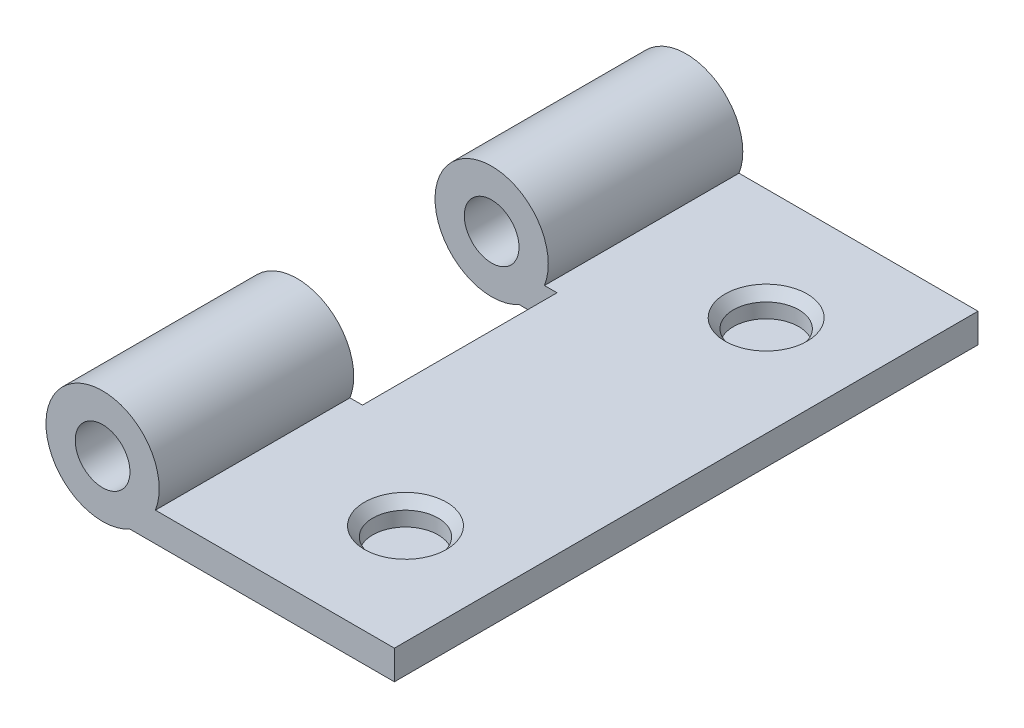
ISO-10303-21;
HEADER;
FILE_DESCRIPTION(('STEP AP214'),'2;1');
FILE_NAME('part.step','',(''),(''),'','','');
FILE_SCHEMA(('AUTOMOTIVE_DESIGN { 1 0 10303 214 1 1 1 1 }'));
ENDSEC;
DATA;
#1=APPLICATION_CONTEXT('core data for automotive mechanical design processes');
#2=APPLICATION_PROTOCOL_DEFINITION('international standard','automotive_design',2000,#1);
#3=PRODUCT_CONTEXT('',#1,'mechanical');
#4=PRODUCT('Part','Part','',(#3));
#5=PRODUCT_RELATED_PRODUCT_CATEGORY('part','',(#4));
#6=PRODUCT_DEFINITION_FORMATION('','',#4);
#7=PRODUCT_DEFINITION_CONTEXT('part definition',#1,'design');
#8=PRODUCT_DEFINITION('design','',#6,#7);
#9=PRODUCT_DEFINITION_SHAPE('','',#8);
#10=(LENGTH_UNIT() NAMED_UNIT(*) SI_UNIT(.MILLI.,.METRE.));
#11=(NAMED_UNIT(*) PLANE_ANGLE_UNIT() SI_UNIT($,.RADIAN.));
#12=(NAMED_UNIT(*) SI_UNIT($,.STERADIAN.) SOLID_ANGLE_UNIT());
#13=UNCERTAINTY_MEASURE_WITH_UNIT(LENGTH_MEASURE(1.E-05),#10,'distance_accuracy_value','');
#14=(GEOMETRIC_REPRESENTATION_CONTEXT(3) GLOBAL_UNCERTAINTY_ASSIGNED_CONTEXT((#13)) GLOBAL_UNIT_ASSIGNED_CONTEXT((#10,
#11,#12)) REPRESENTATION_CONTEXT('',''));
#15=CARTESIAN_POINT('',(0.,0.,0.));
#16=DIRECTION('',(0.,0.,1.));
#17=DIRECTION('',(1.,0.,0.));
#18=AXIS2_PLACEMENT_3D('',#15,#16,#17);
#19=CARTESIAN_POINT('',(0.,0.,12.7));
#20=DIRECTION('',(0.,0.,-1.));
#21=DIRECTION('',(-1.,0.,0.));
#22=AXIS2_PLACEMENT_3D('',#19,#20,#21);
#23=CYLINDRICAL_SURFACE('',#22,2.4638);
#24=CARTESIAN_POINT('',(0.,0.,4.23333333333333));
#25=DIRECTION('',(0.,0.,1.));
#26=DIRECTION('',(1.,0.,0.));
#27=AXIS2_PLACEMENT_3D('',#24,#25,#26);
#28=CIRCLE('',#27,2.4638);
#29=CARTESIAN_POINT('',(2.29858895736219,-0.887017048930075,4.23333333333333));
#30=VERTEX_POINT('',#29);
#31=CARTESIAN_POINT('',(1.190625,-2.15701704893007,4.23333333333333));
#32=VERTEX_POINT('',#31);
#33=EDGE_CURVE('E109',#30,#32,#28,.T.);
#34=ORIENTED_EDGE('',*,*,#33,.T.);
#35=DIRECTION('',(0.,0.,-1.));
#36=VECTOR('',#35,1.);
#37=CARTESIAN_POINT('',(1.190625,-2.15701704893007,12.7));
#38=LINE('',#37,#36);
#39=CARTESIAN_POINT('',(1.190625,-2.15701704893007,12.7));
#40=VERTEX_POINT('',#39);
#41=EDGE_CURVE('E171',#40,#32,#38,.T.);
#42=ORIENTED_EDGE('',*,*,#41,.F.);
#43=CARTESIAN_POINT('',(0.,0.,12.7));
#44=DIRECTION('',(0.,0.,1.));
#45=DIRECTION('',(-1.,0.,0.));
#46=AXIS2_PLACEMENT_3D('',#43,#44,#45);
#47=CIRCLE('',#46,2.4638);
#48=CARTESIAN_POINT('',(2.29858895736219,-0.887017048930075,12.7));
#49=VERTEX_POINT('',#48);
#50=EDGE_CURVE('E156',#49,#40,#47,.T.);
#51=ORIENTED_EDGE('',*,*,#50,.F.);
#52=DIRECTION('',(0.,0.,-1.));
#53=VECTOR('',#52,1.);
#54=CARTESIAN_POINT('',(2.29858895736219,-0.887017048930075,12.7));
#55=LINE('',#54,#53);
#56=EDGE_CURVE('E175',#49,#30,#55,.T.);
#57=ORIENTED_EDGE('',*,*,#56,.T.);
#58=EDGE_LOOP('',(#34,#42,#51,#57));
#59=FACE_BOUND('',#58,.T.);
#60=ADVANCED_FACE('F34',(#59),#23,.T.);
#61=CARTESIAN_POINT('',(0.,0.,12.7));
#62=DIRECTION('',(0.,0.,-1.));
#63=DIRECTION('',(-1.,0.,0.));
#64=AXIS2_PLACEMENT_3D('',#61,#62,#63);
#65=CYLINDRICAL_SURFACE('',#64,1.190625);
#66=CARTESIAN_POINT('',(0.,0.,-4.23333333333334));
#67=DIRECTION('',(0.,0.,-1.));
#68=DIRECTION('',(-1.,0.,0.));
#69=AXIS2_PLACEMENT_3D('',#66,#67,#68);
#70=CIRCLE('',#69,1.190625);
#71=CARTESIAN_POINT('',(-1.190625,0.,-4.23333333333334));
#72=VERTEX_POINT('',#71);
#73=EDGE_CURVE('E112',#72,#72,#70,.T.);
#74=ORIENTED_EDGE('',*,*,#73,.F.);
#75=EDGE_LOOP('',(#74));
#76=FACE_BOUND('',#75,.T.);
#77=CARTESIAN_POINT('',(0.,0.,-12.7));
#78=DIRECTION('',(0.,0.,1.));
#79=DIRECTION('',(1.,0.,0.));
#80=AXIS2_PLACEMENT_3D('',#77,#78,#79);
#81=CIRCLE('',#80,1.190625);
#82=CARTESIAN_POINT('',(1.190625,0.,-12.7));
#83=VERTEX_POINT('',#82);
#84=EDGE_CURVE('E150',#83,#83,#81,.T.);
#85=ORIENTED_EDGE('',*,*,#84,.F.);
#86=EDGE_LOOP('',(#85));
#87=FACE_BOUND('',#86,.T.);
#88=ADVANCED_FACE('F223',(#76,#87),#65,.F.);
#89=CARTESIAN_POINT('',(12.7,-0.887017048930074,12.7));
#90=DIRECTION('',(0.,-1.,0.));
#91=DIRECTION('',(1.,0.,0.));
#92=AXIS2_PLACEMENT_3D('',#89,#90,#91);
#93=PLANE('',#92);
#94=CARTESIAN_POINT('',(2.29858895736219,-0.887017048930075,-4.23333333333334));
#95=VERTEX_POINT('',#94);
#96=CARTESIAN_POINT('',(2.29858895736219,-0.887017048930075,-12.7));
#97=VERTEX_POINT('',#96);
#98=EDGE_CURVE('E174',#95,#97,#55,.T.);
#99=ORIENTED_EDGE('',*,*,#98,.F.);
#100=DIRECTION('',(1.,0.,0.));
#101=VECTOR('',#100,1.);
#102=CARTESIAN_POINT('',(12.7,-0.887017048930074,-4.23333333333334));
#103=LINE('',#102,#101);
#104=CARTESIAN_POINT('',(2.8448,-0.887017048930075,-4.23333333333333));
#105=VERTEX_POINT('',#104);
#106=EDGE_CURVE('E126',#95,#105,#103,.T.);
#107=ORIENTED_EDGE('',*,*,#106,.T.);
#108=DIRECTION('',(0.,0.,1.));
#109=VECTOR('',#108,1.);
#110=CARTESIAN_POINT('',(2.8448,-0.887017048930075,12.7));
#111=LINE('',#110,#109);
#112=CARTESIAN_POINT('',(2.8448,-0.887017048930075,4.23333333333333));
#113=VERTEX_POINT('',#112);
#114=EDGE_CURVE('E117',#105,#113,#111,.T.);
#115=ORIENTED_EDGE('',*,*,#114,.T.);
#116=DIRECTION('',(-1.,0.,0.));
#117=VECTOR('',#116,1.);
#118=CARTESIAN_POINT('',(12.7,-0.887017048930074,4.23333333333333));
#119=LINE('',#118,#117);
#120=EDGE_CURVE('E107',#113,#30,#119,.T.);
#121=ORIENTED_EDGE('',*,*,#120,.T.);
#122=ORIENTED_EDGE('',*,*,#56,.F.);
#123=DIRECTION('',(-1.,0.,0.));
#124=VECTOR('',#123,1.);
#125=CARTESIAN_POINT('',(12.7,-0.887017048930074,12.7));
#126=LINE('',#125,#124);
#127=CARTESIAN_POINT('',(12.7,-0.887017048930074,12.7));
#128=VERTEX_POINT('',#127);
#129=EDGE_CURVE('E86',#128,#49,#126,.T.);
#130=ORIENTED_EDGE('',*,*,#129,.F.);
#131=DIRECTION('',(0.,0.,-1.));
#132=VECTOR('',#131,1.);
#133=CARTESIAN_POINT('',(12.7,-0.887017048930074,12.7));
#134=LINE('',#133,#132);
#135=CARTESIAN_POINT('',(12.7,-0.887017048930074,-12.7));
#136=VERTEX_POINT('',#135);
#137=EDGE_CURVE('E42',#128,#136,#134,.T.);
#138=ORIENTED_EDGE('',*,*,#137,.T.);
#139=DIRECTION('',(-1.,0.,0.));
#140=VECTOR('',#139,1.);
#141=CARTESIAN_POINT('',(12.7,-0.887017048930074,-12.7));
#142=LINE('',#141,#140);
#143=EDGE_CURVE('E162',#136,#97,#142,.T.);
#144=ORIENTED_EDGE('',*,*,#143,.T.);
#145=EDGE_LOOP('',(#99,#107,#115,#121,#122,#130,#138,#144));
#146=FACE_BOUND('',#145,.T.);
#147=CARTESIAN_POINT('',(8.3312,-0.887017048930075,-7.8486));
#148=DIRECTION('',(0.,-1.,0.));
#149=DIRECTION('',(1.,0.,0.));
#150=AXIS2_PLACEMENT_3D('',#147,#148,#149);
#151=CIRCLE('',#150,1.78471573137661);
#152=CARTESIAN_POINT('',(10.1159157313766,-0.887017048930074,-7.8486));
#153=VERTEX_POINT('',#152);
#154=EDGE_CURVE('E145',#153,#153,#151,.F.);
#155=ORIENTED_EDGE('',*,*,#154,.F.);
#156=EDGE_LOOP('',(#155));
#157=FACE_BOUND('',#156,.T.);
#158=CARTESIAN_POINT('',(8.3312,-0.887017048930075,7.8486));
#159=DIRECTION('',(0.,-1.,0.));
#160=DIRECTION('',(1.,0.,0.));
#161=AXIS2_PLACEMENT_3D('',#158,#159,#160);
#162=CIRCLE('',#161,1.78471573137661);
#163=CARTESIAN_POINT('',(10.1159157313766,-0.887017048930074,7.8486));
#164=VERTEX_POINT('',#163);
#165=EDGE_CURVE('E138',#164,#164,#162,.F.);
#166=ORIENTED_EDGE('',*,*,#165,.F.);
#167=EDGE_LOOP('',(#166));
#168=FACE_BOUND('',#167,.T.);
#169=ADVANCED_FACE('F124',(#146,#157,#168),#93,.F.);
#170=CARTESIAN_POINT('',(0.,0.,12.7));
#171=DIRECTION('',(0.,0.,-1.));
#172=DIRECTION('',(-1.,0.,0.));
#173=AXIS2_PLACEMENT_3D('',#170,#171,#172);
#174=PLANE('',#173);
#175=DIRECTION('',(0.,1.,0.));
#176=VECTOR('',#175,1.);
#177=CARTESIAN_POINT('',(12.7,-2.15701704893007,12.7));
#178=LINE('',#177,#176);
#179=CARTESIAN_POINT('',(12.7,-2.15701704893007,12.7));
#180=VERTEX_POINT('',#179);
#181=EDGE_CURVE('E153',#180,#128,#178,.T.);
#182=ORIENTED_EDGE('',*,*,#181,.T.);
#183=ORIENTED_EDGE('',*,*,#129,.T.);
#184=ORIENTED_EDGE('',*,*,#50,.T.);
#185=DIRECTION('',(1.,0.,0.));
#186=VECTOR('',#185,1.);
#187=CARTESIAN_POINT('',(12.7,-2.15701704893007,12.7));
#188=LINE('',#187,#186);
#189=EDGE_CURVE('E58',#40,#180,#188,.T.);
#190=ORIENTED_EDGE('',*,*,#189,.T.);
#191=EDGE_LOOP('',(#182,#183,#184,#190));
#192=FACE_BOUND('',#191,.T.);
#193=CARTESIAN_POINT('',(0.,0.,12.7));
#194=DIRECTION('',(0.,0.,1.));
#195=DIRECTION('',(1.,0.,0.));
#196=AXIS2_PLACEMENT_3D('',#193,#194,#195);
#197=CIRCLE('',#196,1.190625);
#198=CARTESIAN_POINT('',(1.190625,0.,12.7));
#199=VERTEX_POINT('',#198);
#200=EDGE_CURVE('E146',#199,#199,#197,.T.);
#201=ORIENTED_EDGE('',*,*,#200,.F.);
#202=EDGE_LOOP('',(#201));
#203=FACE_BOUND('',#202,.T.);
#204=ADVANCED_FACE('F202',(#192,#203),#174,.F.);
#205=CARTESIAN_POINT('',(0.,0.,-12.7));
#206=DIRECTION('',(0.,0.,-1.));
#207=DIRECTION('',(-1.,0.,0.));
#208=AXIS2_PLACEMENT_3D('',#205,#206,#207);
#209=PLANE('',#208);
#210=DIRECTION('',(0.,1.,0.));
#211=VECTOR('',#210,1.);
#212=CARTESIAN_POINT('',(12.7,-2.15701704893007,-12.7));
#213=LINE('',#212,#211);
#214=CARTESIAN_POINT('',(12.7,-2.15701704893007,-12.7));
#215=VERTEX_POINT('',#214);
#216=EDGE_CURVE('E149',#215,#136,#213,.T.);
#217=ORIENTED_EDGE('',*,*,#216,.F.);
#218=DIRECTION('',(1.,0.,0.));
#219=VECTOR('',#218,1.);
#220=CARTESIAN_POINT('',(12.7,-2.15701704893007,-12.7));
#221=LINE('',#220,#219);
#222=CARTESIAN_POINT('',(1.190625,-2.15701704893007,-12.7));
#223=VERTEX_POINT('',#222);
#224=EDGE_CURVE('E78',#223,#215,#221,.T.);
#225=ORIENTED_EDGE('',*,*,#224,.F.);
#226=CARTESIAN_POINT('',(0.,0.,-12.7));
#227=DIRECTION('',(0.,0.,1.));
#228=DIRECTION('',(-1.,0.,0.));
#229=AXIS2_PLACEMENT_3D('',#226,#227,#228);
#230=CIRCLE('',#229,2.4638);
#231=EDGE_CURVE('E165',#97,#223,#230,.T.);
#232=ORIENTED_EDGE('',*,*,#231,.F.);
#233=ORIENTED_EDGE('',*,*,#143,.F.);
#234=EDGE_LOOP('',(#217,#225,#232,#233));
#235=FACE_BOUND('',#234,.T.);
#236=ORIENTED_EDGE('',*,*,#84,.T.);
#237=EDGE_LOOP('',(#236));
#238=FACE_BOUND('',#237,.T.);
#239=ADVANCED_FACE('F210',(#235,#238),#209,.T.);
#240=CARTESIAN_POINT('',(12.7,-2.15701704893007,12.7));
#241=DIRECTION('',(-1.,0.,0.));
#242=DIRECTION('',(0.,0.,1.));
#243=AXIS2_PLACEMENT_3D('',#240,#241,#242);
#244=PLANE('',#243);
#245=ORIENTED_EDGE('',*,*,#216,.T.);
#246=ORIENTED_EDGE('',*,*,#137,.F.);
#247=ORIENTED_EDGE('',*,*,#181,.F.);
#248=DIRECTION('',(0.,0.,-1.));
#249=VECTOR('',#248,1.);
#250=CARTESIAN_POINT('',(12.7,-2.15701704893007,12.7));
#251=LINE('',#250,#249);
#252=EDGE_CURVE('E159',#180,#215,#251,.T.);
#253=ORIENTED_EDGE('',*,*,#252,.T.);
#254=EDGE_LOOP('',(#245,#246,#247,#253));
#255=FACE_BOUND('',#254,.T.);
#256=ADVANCED_FACE('F36',(#255),#244,.F.);
#257=CARTESIAN_POINT('',(1.190625,-2.15701704893007,-4.23333333333334));
#258=VERTEX_POINT('',#257);
#259=EDGE_CURVE('E170',#258,#223,#38,.T.);
#260=ORIENTED_EDGE('',*,*,#259,.F.);
#261=CARTESIAN_POINT('',(0.,0.,-4.23333333333334));
#262=DIRECTION('',(0.,0.,-1.));
#263=DIRECTION('',(-1.,0.,0.));
#264=AXIS2_PLACEMENT_3D('',#261,#262,#263);
#265=CIRCLE('',#264,2.4638);
#266=EDGE_CURVE('E132',#258,#95,#265,.T.);
#267=ORIENTED_EDGE('',*,*,#266,.T.);
#268=ORIENTED_EDGE('',*,*,#98,.T.);
#269=ORIENTED_EDGE('',*,*,#231,.T.);
#270=EDGE_LOOP('',(#260,#267,#268,#269));
#271=FACE_BOUND('',#270,.T.);
#272=ADVANCED_FACE('F213',(#271),#23,.T.);
#273=CARTESIAN_POINT('',(12.7,-2.15701704893007,12.7));
#274=DIRECTION('',(0.,1.,0.));
#275=DIRECTION('',(-1.,0.,0.));
#276=AXIS2_PLACEMENT_3D('',#273,#274,#275);
#277=PLANE('',#276);
#278=DIRECTION('',(0.,0.,-1.));
#279=VECTOR('',#278,1.);
#280=CARTESIAN_POINT('',(2.8448,-2.15701704893007,12.7));
#281=LINE('',#280,#279);
#282=CARTESIAN_POINT('',(2.8448,-2.15701704893007,4.23333333333333));
#283=VERTEX_POINT('',#282);
#284=CARTESIAN_POINT('',(2.8448,-2.15701704893007,-4.23333333333333));
#285=VERTEX_POINT('',#284);
#286=EDGE_CURVE('E11',#283,#285,#281,.T.);
#287=ORIENTED_EDGE('',*,*,#286,.T.);
#288=DIRECTION('',(-1.,0.,0.));
#289=VECTOR('',#288,1.);
#290=CARTESIAN_POINT('',(12.7,-2.15701704893007,-4.23333333333334));
#291=LINE('',#290,#289);
#292=EDGE_CURVE('E186',#285,#258,#291,.T.);
#293=ORIENTED_EDGE('',*,*,#292,.T.);
#294=ORIENTED_EDGE('',*,*,#259,.T.);
#295=ORIENTED_EDGE('',*,*,#224,.T.);
#296=ORIENTED_EDGE('',*,*,#252,.F.);
#297=ORIENTED_EDGE('',*,*,#189,.F.);
#298=ORIENTED_EDGE('',*,*,#41,.T.);
#299=DIRECTION('',(1.,0.,0.));
#300=VECTOR('',#299,1.);
#301=CARTESIAN_POINT('',(12.7,-2.15701704893007,4.23333333333333));
#302=LINE('',#301,#300);
#303=EDGE_CURVE('E184',#32,#283,#302,.T.);
#304=ORIENTED_EDGE('',*,*,#303,.T.);
#305=EDGE_LOOP('',(#287,#293,#294,#295,#296,#297,#298,#304));
#306=FACE_BOUND('',#305,.T.);
#307=ADVANCED_FACE('F198',(#306),#277,.F.);
#308=CARTESIAN_POINT('',(0.,0.,4.23333333333333));
#309=DIRECTION('',(0.,0.,1.));
#310=DIRECTION('',(1.,0.,0.));
#311=AXIS2_PLACEMENT_3D('',#308,#309,#310);
#312=CIRCLE('',#311,1.190625);
#313=CARTESIAN_POINT('',(1.190625,0.,4.23333333333333));
#314=VERTEX_POINT('',#313);
#315=EDGE_CURVE('E182',#314,#314,#312,.T.);
#316=ORIENTED_EDGE('',*,*,#315,.F.);
#317=EDGE_LOOP('',(#316));
#318=FACE_BOUND('',#317,.T.);
#319=ORIENTED_EDGE('',*,*,#200,.T.);
#320=EDGE_LOOP('',(#319));
#321=FACE_BOUND('',#320,.T.);
#322=ADVANCED_FACE('F220',(#318,#321),#65,.F.);
#323=CARTESIAN_POINT('',(8.3312,-1.3038136197449,-7.8486));
#324=DIRECTION('',(0.,1.,0.));
#325=DIRECTION('',(0.,0.,1.));
#326=AXIS2_PLACEMENT_3D('',#323,#324,#325);
#327=CONICAL_SURFACE('',#326,1.4224,0.715584993317672);
#328=CARTESIAN_POINT('',(8.3312,-1.3038136197449,-7.8486));
#329=DIRECTION('',(0.,1.,0.));
#330=DIRECTION('',(0.,0.,-1.));
#331=AXIS2_PLACEMENT_3D('',#328,#329,#330);
#332=CIRCLE('',#331,1.4224);
#333=CARTESIAN_POINT('',(8.3312,-1.3038136197449,-9.271));
#334=VERTEX_POINT('',#333);
#335=EDGE_CURVE('E142',#334,#334,#332,.F.);
#336=ORIENTED_EDGE('',*,*,#335,.T.);
#337=EDGE_LOOP('',(#336));
#338=FACE_BOUND('',#337,.T.);
#339=ORIENTED_EDGE('',*,*,#154,.T.);
#340=EDGE_LOOP('',(#339));
#341=FACE_BOUND('',#340,.T.);
#342=ADVANCED_FACE('F236',(#338,#341),#327,.F.);
#343=CARTESIAN_POINT('',(12.7,-1.93881361974491,12.7));
#344=DIRECTION('',(0.,1.,0.));
#345=DIRECTION('',(0.,0.,1.));
#346=AXIS2_PLACEMENT_3D('',#343,#344,#345);
#347=PLANE('',#346);
#348=CARTESIAN_POINT('',(8.3312,-1.93881361974491,-7.8486));
#349=DIRECTION('',(0.,-1.,0.));
#350=DIRECTION('',(0.,0.,1.));
#351=AXIS2_PLACEMENT_3D('',#348,#349,#350);
#352=CIRCLE('',#351,1.4224);
#353=CARTESIAN_POINT('',(8.3312,-1.93881361974491,-6.4262));
#354=VERTEX_POINT('',#353);
#355=EDGE_CURVE('E139',#354,#354,#352,.T.);
#356=ORIENTED_EDGE('',*,*,#355,.F.);
#357=EDGE_LOOP('',(#356));
#358=FACE_BOUND('',#357,.T.);
#359=ADVANCED_FACE('F241',(#358),#347,.T.);
#360=CARTESIAN_POINT('',(8.3312,-2.46380000000001,-7.8486));
#361=DIRECTION('',(0.,1.,0.));
#362=DIRECTION('',(0.,0.,1.));
#363=AXIS2_PLACEMENT_3D('',#360,#361,#362);
#364=CYLINDRICAL_SURFACE('',#363,1.4224);
#365=ORIENTED_EDGE('',*,*,#335,.F.);
#366=EDGE_LOOP('',(#365));
#367=FACE_BOUND('',#366,.T.);
#368=ORIENTED_EDGE('',*,*,#355,.T.);
#369=EDGE_LOOP('',(#368));
#370=FACE_BOUND('',#369,.T.);
#371=ADVANCED_FACE('F278',(#367,#370),#364,.F.);
#372=CARTESIAN_POINT('',(8.3312,-1.30381361974491,7.8486));
#373=DIRECTION('',(0.,1.,0.));
#374=DIRECTION('',(0.,0.,1.));
#375=AXIS2_PLACEMENT_3D('',#372,#373,#374);
#376=CONICAL_SURFACE('',#375,1.4224,0.715584993317671);
#377=CARTESIAN_POINT('',(8.3312,-1.30381361974491,7.8486));
#378=DIRECTION('',(0.,1.,0.));
#379=DIRECTION('',(0.,0.,-1.));
#380=AXIS2_PLACEMENT_3D('',#377,#378,#379);
#381=CIRCLE('',#380,1.4224);
#382=CARTESIAN_POINT('',(8.3312,-1.30381361974491,6.4262));
#383=VERTEX_POINT('',#382);
#384=EDGE_CURVE('E130',#383,#383,#381,.F.);
#385=ORIENTED_EDGE('',*,*,#384,.T.);
#386=EDGE_LOOP('',(#385));
#387=FACE_BOUND('',#386,.T.);
#388=ORIENTED_EDGE('',*,*,#165,.T.);
#389=EDGE_LOOP('',(#388));
#390=FACE_BOUND('',#389,.T.);
#391=ADVANCED_FACE('F287',(#387,#390),#376,.F.);
#392=CARTESIAN_POINT('',(12.7,-1.93881361974491,12.7));
#393=DIRECTION('',(0.,1.,0.));
#394=DIRECTION('',(0.,0.,1.));
#395=AXIS2_PLACEMENT_3D('',#392,#393,#394);
#396=PLANE('',#395);
#397=CARTESIAN_POINT('',(8.3312,-1.93881361974491,7.8486));
#398=DIRECTION('',(0.,-1.,0.));
#399=DIRECTION('',(0.,0.,1.));
#400=AXIS2_PLACEMENT_3D('',#397,#398,#399);
#401=CIRCLE('',#400,1.4224);
#402=CARTESIAN_POINT('',(8.3312,-1.93881361974491,9.271));
#403=VERTEX_POINT('',#402);
#404=EDGE_CURVE('E127',#403,#403,#401,.T.);
#405=ORIENTED_EDGE('',*,*,#404,.F.);
#406=EDGE_LOOP('',(#405));
#407=FACE_BOUND('',#406,.T.);
#408=ADVANCED_FACE('F298',(#407),#396,.T.);
#409=CARTESIAN_POINT('',(8.3312,-2.46380000000001,7.8486));
#410=DIRECTION('',(0.,1.,0.));
#411=DIRECTION('',(0.,0.,1.));
#412=AXIS2_PLACEMENT_3D('',#409,#410,#411);
#413=CYLINDRICAL_SURFACE('',#412,1.4224);
#414=ORIENTED_EDGE('',*,*,#384,.F.);
#415=EDGE_LOOP('',(#414));
#416=FACE_BOUND('',#415,.T.);
#417=ORIENTED_EDGE('',*,*,#404,.T.);
#418=EDGE_LOOP('',(#417));
#419=FACE_BOUND('',#418,.T.);
#420=ADVANCED_FACE('F309',(#416,#419),#413,.F.);
#421=CARTESIAN_POINT('',(2.8448,-2.46380000000001,-4.23333333333333));
#422=DIRECTION('',(1.,0.,0.));
#423=DIRECTION('',(0.,0.,-1.));
#424=AXIS2_PLACEMENT_3D('',#421,#422,#423);
#425=PLANE('',#424);
#426=DIRECTION('',(0.,1.,0.));
#427=VECTOR('',#426,1.);
#428=CARTESIAN_POINT('',(2.8448,-2.46380000000001,-4.23333333333333));
#429=LINE('',#428,#427);
#430=EDGE_CURVE('E120',#285,#105,#429,.T.);
#431=ORIENTED_EDGE('',*,*,#430,.F.);
#432=ORIENTED_EDGE('',*,*,#286,.F.);
#433=DIRECTION('',(0.,1.,0.));
#434=VECTOR('',#433,1.);
#435=CARTESIAN_POINT('',(2.8448,-2.46380000000001,4.23333333333333));
#436=LINE('',#435,#434);
#437=EDGE_CURVE('E49',#283,#113,#436,.T.);
#438=ORIENTED_EDGE('',*,*,#437,.T.);
#439=ORIENTED_EDGE('',*,*,#114,.F.);
#440=EDGE_LOOP('',(#431,#432,#438,#439));
#441=FACE_BOUND('',#440,.T.);
#442=ADVANCED_FACE('F116',(#441),#425,.F.);
#443=CARTESIAN_POINT('',(-2.8448,-2.46380000000001,-4.23333333333333));
#444=DIRECTION('',(0.,0.,-1.));
#445=DIRECTION('',(-1.,0.,0.));
#446=AXIS2_PLACEMENT_3D('',#443,#444,#445);
#447=PLANE('',#446);
#448=ORIENTED_EDGE('',*,*,#73,.T.);
#449=EDGE_LOOP('',(#448));
#450=FACE_BOUND('',#449,.T.);
#451=ORIENTED_EDGE('',*,*,#266,.F.);
#452=ORIENTED_EDGE('',*,*,#292,.F.);
#453=ORIENTED_EDGE('',*,*,#430,.T.);
#454=ORIENTED_EDGE('',*,*,#106,.F.);
#455=EDGE_LOOP('',(#451,#452,#453,#454));
#456=FACE_BOUND('',#455,.T.);
#457=ADVANCED_FACE('F197',(#450,#456),#447,.F.);
#458=CARTESIAN_POINT('',(-2.8448,-2.46380000000001,4.23333333333333));
#459=DIRECTION('',(0.,0.,1.));
#460=DIRECTION('',(1.,0.,0.));
#461=AXIS2_PLACEMENT_3D('',#458,#459,#460);
#462=PLANE('',#461);
#463=ORIENTED_EDGE('',*,*,#315,.T.);
#464=EDGE_LOOP('',(#463));
#465=FACE_BOUND('',#464,.T.);
#466=ORIENTED_EDGE('',*,*,#437,.F.);
#467=ORIENTED_EDGE('',*,*,#303,.F.);
#468=ORIENTED_EDGE('',*,*,#33,.F.);
#469=ORIENTED_EDGE('',*,*,#120,.F.);
#470=EDGE_LOOP('',(#466,#467,#468,#469));
#471=FACE_BOUND('',#470,.T.);
#472=ADVANCED_FACE('F108',(#465,#471),#462,.F.);
#473=CLOSED_SHELL('',(#60,#88,#169,#204,#239,#256,#272,#307,#322,#342,#359,#371,#391,#408,#420,
#442,#457,#472));
#474=MANIFOLD_SOLID_BREP('B2',#473);
#475=ADVANCED_BREP_SHAPE_REPRESENTATION('',(#18,#474),#14);
#476=SHAPE_DEFINITION_REPRESENTATION(#9,#475);
ENDSEC;
END-ISO-10303-21;
